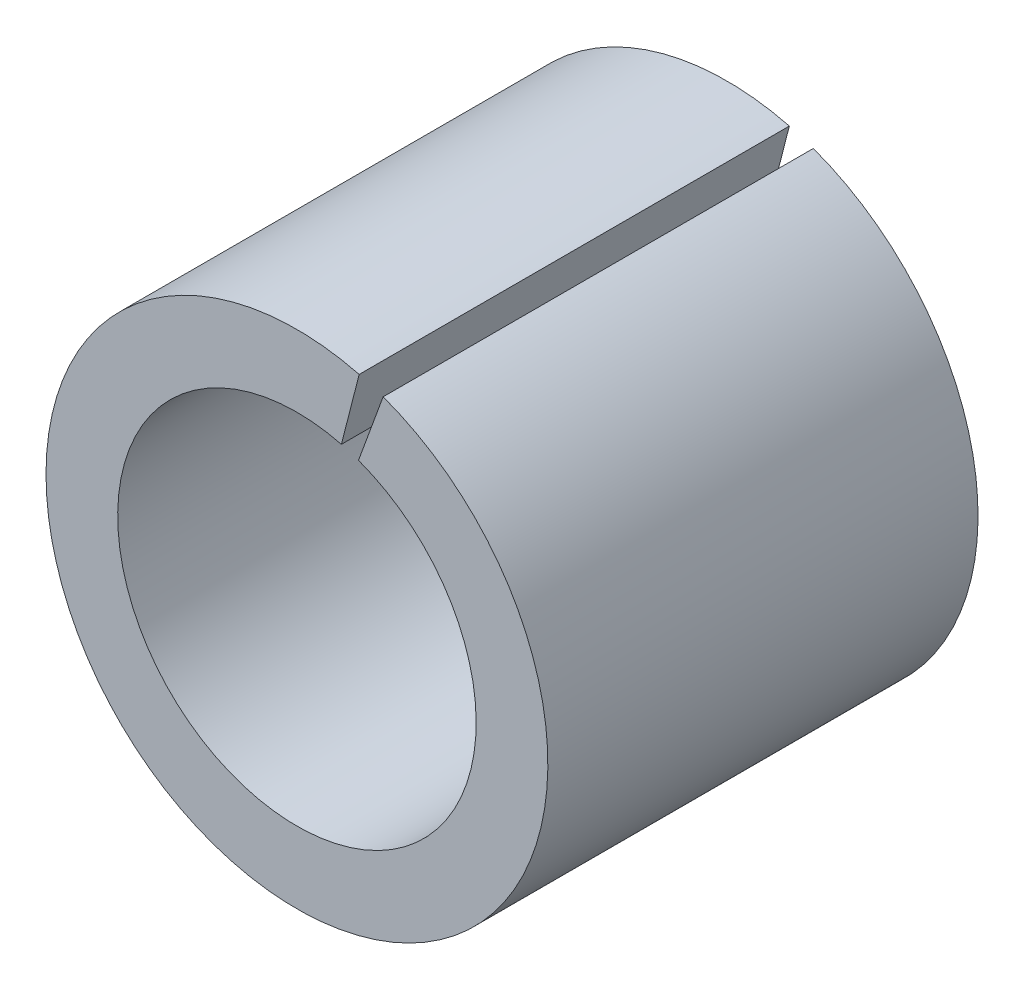
ISO-10303-21;
HEADER;
FILE_DESCRIPTION(('STEP AP214'),'2;1');
FILE_NAME('part.step','',(''),(''),'','','');
FILE_SCHEMA(('AUTOMOTIVE_DESIGN { 1 0 10303 214 1 1 1 1 }'));
ENDSEC;
DATA;
#1=APPLICATION_CONTEXT('core data for automotive mechanical design processes');
#2=APPLICATION_PROTOCOL_DEFINITION('international standard','automotive_design',2000,#1);
#3=PRODUCT_CONTEXT('',#1,'mechanical');
#4=PRODUCT('Part','Part','',(#3));
#5=PRODUCT_RELATED_PRODUCT_CATEGORY('part','',(#4));
#6=PRODUCT_DEFINITION_FORMATION('','',#4);
#7=PRODUCT_DEFINITION_CONTEXT('part definition',#1,'design');
#8=PRODUCT_DEFINITION('design','',#6,#7);
#9=PRODUCT_DEFINITION_SHAPE('','',#8);
#10=(LENGTH_UNIT() NAMED_UNIT(*) SI_UNIT(.MILLI.,.METRE.));
#11=(NAMED_UNIT(*) PLANE_ANGLE_UNIT() SI_UNIT($,.RADIAN.));
#12=(NAMED_UNIT(*) SI_UNIT($,.STERADIAN.) SOLID_ANGLE_UNIT());
#13=UNCERTAINTY_MEASURE_WITH_UNIT(LENGTH_MEASURE(1.E-05),#10,'distance_accuracy_value','');
#14=(GEOMETRIC_REPRESENTATION_CONTEXT(3) GLOBAL_UNCERTAINTY_ASSIGNED_CONTEXT((#13)) GLOBAL_UNIT_ASSIGNED_CONTEXT((#10,
#11,#12)) REPRESENTATION_CONTEXT('',''));
#15=CARTESIAN_POINT('',(0.,0.,0.));
#16=DIRECTION('',(0.,0.,1.));
#17=DIRECTION('',(1.,0.,0.));
#18=AXIS2_PLACEMENT_3D('',#15,#16,#17);
#19=CARTESIAN_POINT('',(0.,0.,6.));
#20=DIRECTION('',(0.,0.,1.));
#21=DIRECTION('',(1.,0.,0.));
#22=AXIS2_PLACEMENT_3D('',#19,#20,#21);
#23=PLANE('',#22);
#24=DIRECTION('',(0.343504443632542,0.939151051324917,0.));
#25=VECTOR('',#24,1.);
#26=CARTESIAN_POINT('',(1.70817035910886,4.67018700437904,6.));
#27=LINE('',#26,#25);
#28=CARTESIAN_POINT('',(0.858761109081354,2.34787762831229,6.));
#29=VERTEX_POINT('',#28);
#30=CARTESIAN_POINT('',(1.2022655527139,3.28702867963721,6.));
#31=VERTEX_POINT('',#30);
#32=EDGE_CURVE('E74',#29,#31,#27,.T.);
#33=ORIENTED_EDGE('',*,*,#32,.F.);
#34=CARTESIAN_POINT('',(0.,0.,6.));
#35=DIRECTION('',(0.,0.,1.));
#36=DIRECTION('',(1.,0.,0.));
#37=AXIS2_PLACEMENT_3D('',#34,#35,#36);
#38=CIRCLE('',#37,2.5);
#39=CARTESIAN_POINT('',(0.620042865626918,2.42188910662424,6.));
#40=VERTEX_POINT('',#39);
#41=EDGE_CURVE('E83',#40,#29,#38,.T.);
#42=ORIENTED_EDGE('',*,*,#41,.F.);
#43=DIRECTION('',(-0.248017146250767,-0.968755642649696,0.));
#44=VECTOR('',#43,1.);
#45=CARTESIAN_POINT('',(0.,0.,6.));
#46=LINE('',#45,#44);
#47=CARTESIAN_POINT('',(0.868060011877686,3.39064474927394,6.));
#48=VERTEX_POINT('',#47);
#49=EDGE_CURVE('E57',#48,#40,#46,.T.);
#50=ORIENTED_EDGE('',*,*,#49,.F.);
#51=CARTESIAN_POINT('',(0.,0.,6.));
#52=DIRECTION('',(0.,0.,1.));
#53=DIRECTION('',(1.,0.,0.));
#54=AXIS2_PLACEMENT_3D('',#51,#52,#53);
#55=CIRCLE('',#54,3.5);
#56=EDGE_CURVE('E85',#48,#31,#55,.T.);
#57=ORIENTED_EDGE('',*,*,#56,.T.);
#58=EDGE_LOOP('',(#33,#42,#50,#57));
#59=FACE_BOUND('',#58,.T.);
#60=ADVANCED_FACE('F35',(#59),#23,.T.);
#61=CARTESIAN_POINT('',(0.,0.,0.));
#62=DIRECTION('',(0.,0.,1.));
#63=DIRECTION('',(1.,0.,0.));
#64=AXIS2_PLACEMENT_3D('',#61,#62,#63);
#65=PLANE('',#64);
#66=CARTESIAN_POINT('',(0.,0.,0.));
#67=DIRECTION('',(0.,0.,1.));
#68=DIRECTION('',(1.,0.,0.));
#69=AXIS2_PLACEMENT_3D('',#66,#67,#68);
#70=CIRCLE('',#69,2.5);
#71=CARTESIAN_POINT('',(0.620042865626918,2.42188910662424,0.));
#72=VERTEX_POINT('',#71);
#73=CARTESIAN_POINT('',(0.858761109081354,2.34787762831229,0.));
#74=VERTEX_POINT('',#73);
#75=EDGE_CURVE('E89',#72,#74,#70,.T.);
#76=ORIENTED_EDGE('',*,*,#75,.T.);
#77=DIRECTION('',(0.343504443632542,0.939151051324917,0.));
#78=VECTOR('',#77,1.);
#79=CARTESIAN_POINT('',(1.70817035910886,4.67018700437904,0.));
#80=LINE('',#79,#78);
#81=CARTESIAN_POINT('',(1.2022655527139,3.28702867963721,0.));
#82=VERTEX_POINT('',#81);
#83=EDGE_CURVE('E49',#74,#82,#80,.T.);
#84=ORIENTED_EDGE('',*,*,#83,.T.);
#85=CARTESIAN_POINT('',(0.,0.,0.));
#86=DIRECTION('',(0.,0.,1.));
#87=DIRECTION('',(1.,0.,0.));
#88=AXIS2_PLACEMENT_3D('',#85,#86,#87);
#89=CIRCLE('',#88,3.5);
#90=CARTESIAN_POINT('',(0.868060011877686,3.39064474927394,0.));
#91=VERTEX_POINT('',#90);
#92=EDGE_CURVE('E88',#91,#82,#89,.T.);
#93=ORIENTED_EDGE('',*,*,#92,.F.);
#94=DIRECTION('',(-0.248017146250767,-0.968755642649696,0.));
#95=VECTOR('',#94,1.);
#96=CARTESIAN_POINT('',(0.,0.,0.));
#97=LINE('',#96,#95);
#98=EDGE_CURVE('E100',#91,#72,#97,.T.);
#99=ORIENTED_EDGE('',*,*,#98,.T.);
#100=EDGE_LOOP('',(#76,#84,#93,#99));
#101=FACE_BOUND('',#100,.T.);
#102=ADVANCED_FACE('F104',(#101),#65,.F.);
#103=CARTESIAN_POINT('',(0.,0.,6.));
#104=DIRECTION('',(0.,0.,-1.));
#105=DIRECTION('',(-1.,0.,0.));
#106=AXIS2_PLACEMENT_3D('',#103,#104,#105);
#107=CYLINDRICAL_SURFACE('',#106,3.5);
#108=ORIENTED_EDGE('',*,*,#92,.T.);
#109=DIRECTION('',(0.,0.,-1.));
#110=VECTOR('',#109,1.);
#111=CARTESIAN_POINT('',(1.2022655527139,3.28702867963721,6.));
#112=LINE('',#111,#110);
#113=EDGE_CURVE('E93',#82,#31,#112,.F.);
#114=ORIENTED_EDGE('',*,*,#113,.T.);
#115=ORIENTED_EDGE('',*,*,#56,.F.);
#116=DIRECTION('',(0.,0.,-1.));
#117=VECTOR('',#116,1.);
#118=CARTESIAN_POINT('',(0.868060011877686,3.39064474927394,6.));
#119=LINE('',#118,#117);
#120=EDGE_CURVE('E105',#48,#91,#119,.T.);
#121=ORIENTED_EDGE('',*,*,#120,.T.);
#122=EDGE_LOOP('',(#108,#114,#115,#121));
#123=FACE_BOUND('',#122,.T.);
#124=ADVANCED_FACE('F37',(#123),#107,.T.);
#125=CARTESIAN_POINT('',(0.,0.,6.));
#126=DIRECTION('',(0.,0.,-1.));
#127=DIRECTION('',(-1.,0.,0.));
#128=AXIS2_PLACEMENT_3D('',#125,#126,#127);
#129=CYLINDRICAL_SURFACE('',#128,2.5);
#130=DIRECTION('',(0.,0.,-1.));
#131=VECTOR('',#130,1.);
#132=CARTESIAN_POINT('',(0.858761109081354,2.34787762831229,6.));
#133=LINE('',#132,#131);
#134=EDGE_CURVE('E11',#74,#29,#133,.F.);
#135=ORIENTED_EDGE('',*,*,#134,.F.);
#136=ORIENTED_EDGE('',*,*,#75,.F.);
#137=DIRECTION('',(0.,0.,-1.));
#138=VECTOR('',#137,1.);
#139=CARTESIAN_POINT('',(0.620042865626918,2.42188910662424,6.));
#140=LINE('',#139,#138);
#141=EDGE_CURVE('E43',#40,#72,#140,.T.);
#142=ORIENTED_EDGE('',*,*,#141,.F.);
#143=ORIENTED_EDGE('',*,*,#41,.T.);
#144=EDGE_LOOP('',(#135,#136,#142,#143));
#145=FACE_BOUND('',#144,.T.);
#146=ADVANCED_FACE('F87',(#145),#129,.F.);
#147=CARTESIAN_POINT('',(0.,0.,0.));
#148=DIRECTION('',(-0.968755642649696,0.248017146250767,0.));
#149=DIRECTION('',(-0.248017146250767,-0.968755642649696,0.));
#150=AXIS2_PLACEMENT_3D('',#147,#148,#149);
#151=PLANE('',#150);
#152=ORIENTED_EDGE('',*,*,#49,.T.);
#153=ORIENTED_EDGE('',*,*,#141,.T.);
#154=ORIENTED_EDGE('',*,*,#98,.F.);
#155=ORIENTED_EDGE('',*,*,#120,.F.);
#156=EDGE_LOOP('',(#152,#153,#154,#155));
#157=FACE_BOUND('',#156,.T.);
#158=ADVANCED_FACE('F99',(#157),#151,.F.);
#159=CARTESIAN_POINT('',(1.70817035910886,4.67018700437904,0.));
#160=DIRECTION('',(0.939151051324918,-0.343504443632542,0.));
#161=DIRECTION('',(0.343504443632542,0.939151051324918,0.));
#162=AXIS2_PLACEMENT_3D('',#159,#160,#161);
#163=PLANE('',#162);
#164=ORIENTED_EDGE('',*,*,#83,.F.);
#165=ORIENTED_EDGE('',*,*,#134,.T.);
#166=ORIENTED_EDGE('',*,*,#32,.T.);
#167=ORIENTED_EDGE('',*,*,#113,.F.);
#168=EDGE_LOOP('',(#164,#165,#166,#167));
#169=FACE_BOUND('',#168,.T.);
#170=ADVANCED_FACE('F73',(#169),#163,.F.);
#171=CLOSED_SHELL('',(#60,#102,#124,#146,#158,#170));
#172=MANIFOLD_SOLID_BREP('B2',#171);
#173=ADVANCED_BREP_SHAPE_REPRESENTATION('',(#18,#172),#14);
#174=SHAPE_DEFINITION_REPRESENTATION(#9,#173);
ENDSEC;
END-ISO-10303-21;
